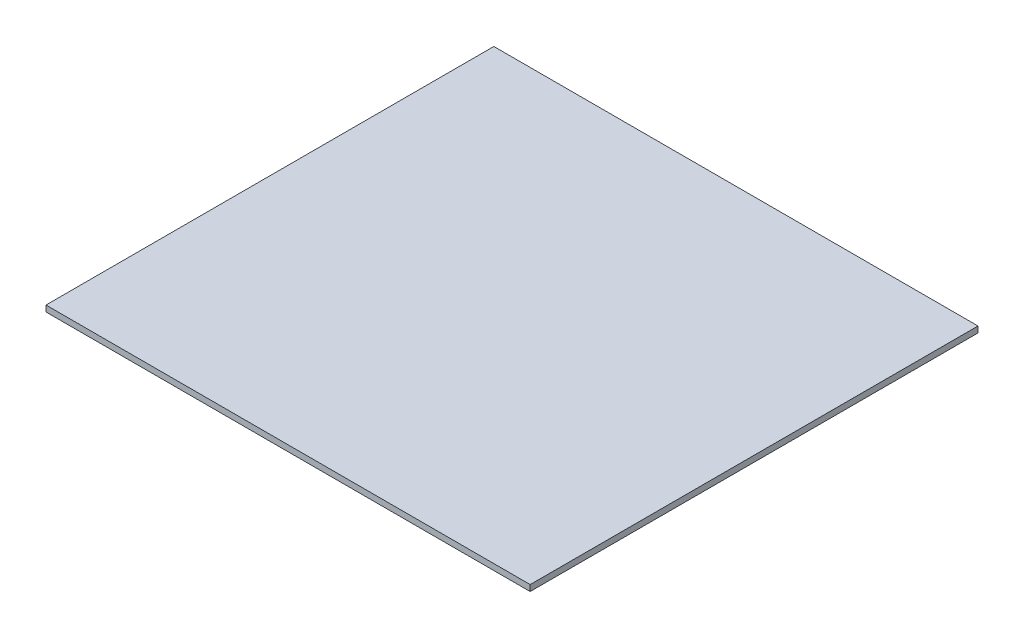
ISO-10303-21;
HEADER;
FILE_DESCRIPTION(('STEP AP214'),'2;1');
FILE_NAME('part.step','',(''),(''),'','','');
FILE_SCHEMA(('AUTOMOTIVE_DESIGN { 1 0 10303 214 1 1 1 1 }'));
ENDSEC;
DATA;
#1=APPLICATION_CONTEXT('core data for automotive mechanical design processes');
#2=APPLICATION_PROTOCOL_DEFINITION('international standard','automotive_design',2000,#1);
#3=PRODUCT_CONTEXT('',#1,'mechanical');
#4=PRODUCT('Part','Part','',(#3));
#5=PRODUCT_RELATED_PRODUCT_CATEGORY('part','',(#4));
#6=PRODUCT_DEFINITION_FORMATION('','',#4);
#7=PRODUCT_DEFINITION_CONTEXT('part definition',#1,'design');
#8=PRODUCT_DEFINITION('design','',#6,#7);
#9=PRODUCT_DEFINITION_SHAPE('','',#8);
#10=(LENGTH_UNIT() NAMED_UNIT(*) SI_UNIT(.MILLI.,.METRE.));
#11=(NAMED_UNIT(*) PLANE_ANGLE_UNIT() SI_UNIT($,.RADIAN.));
#12=(NAMED_UNIT(*) SI_UNIT($,.STERADIAN.) SOLID_ANGLE_UNIT());
#13=UNCERTAINTY_MEASURE_WITH_UNIT(LENGTH_MEASURE(1.E-05),#10,'distance_accuracy_value','');
#14=(GEOMETRIC_REPRESENTATION_CONTEXT(3) GLOBAL_UNCERTAINTY_ASSIGNED_CONTEXT((#13)) GLOBAL_UNIT_ASSIGNED_CONTEXT((#10,
#11,#12)) REPRESENTATION_CONTEXT('',''));
#15=CARTESIAN_POINT('',(0.,0.,0.));
#16=DIRECTION('',(0.,0.,1.));
#17=DIRECTION('',(1.,0.,0.));
#18=AXIS2_PLACEMENT_3D('',#15,#16,#17);
#19=CARTESIAN_POINT('',(0.,6.35,0.));
#20=DIRECTION('',(1.,0.,0.));
#21=DIRECTION('',(0.,0.,-1.));
#22=AXIS2_PLACEMENT_3D('',#19,#20,#21);
#23=PLANE('',#22);
#24=DIRECTION('',(0.,0.,1.));
#25=VECTOR('',#24,1.);
#26=CARTESIAN_POINT('',(0.,0.,0.));
#27=LINE('',#26,#25);
#28=CARTESIAN_POINT('',(0.,0.,-469.9));
#29=VERTEX_POINT('',#28);
#30=CARTESIAN_POINT('',(0.,0.,0.));
#31=VERTEX_POINT('',#30);
#32=EDGE_CURVE('E96',#29,#31,#27,.T.);
#33=ORIENTED_EDGE('',*,*,#32,.T.);
#34=DIRECTION('',(0.,-1.,0.));
#35=VECTOR('',#34,1.);
#36=CARTESIAN_POINT('',(0.,6.35,0.));
#37=LINE('',#36,#35);
#38=CARTESIAN_POINT('',(0.,6.35,0.));
#39=VERTEX_POINT('',#38);
#40=EDGE_CURVE('E11',#39,#31,#37,.T.);
#41=ORIENTED_EDGE('',*,*,#40,.F.);
#42=DIRECTION('',(0.,0.,1.));
#43=VECTOR('',#42,1.);
#44=CARTESIAN_POINT('',(0.,6.35,0.));
#45=LINE('',#44,#43);
#46=CARTESIAN_POINT('',(0.,6.35,-469.9));
#47=VERTEX_POINT('',#46);
#48=EDGE_CURVE('E84',#47,#39,#45,.T.);
#49=ORIENTED_EDGE('',*,*,#48,.F.);
#50=DIRECTION('',(0.,-1.,0.));
#51=VECTOR('',#50,1.);
#52=CARTESIAN_POINT('',(0.,6.35,-469.9));
#53=LINE('',#52,#51);
#54=EDGE_CURVE('E92',#47,#29,#53,.T.);
#55=ORIENTED_EDGE('',*,*,#54,.T.);
#56=EDGE_LOOP('',(#33,#41,#49,#55));
#57=FACE_BOUND('',#56,.T.);
#58=ADVANCED_FACE('F33',(#57),#23,.F.);
#59=CARTESIAN_POINT('',(0.,6.35,0.));
#60=DIRECTION('',(0.,0.,-1.));
#61=DIRECTION('',(-1.,0.,0.));
#62=AXIS2_PLACEMENT_3D('',#59,#60,#61);
#63=PLANE('',#62);
#64=DIRECTION('',(1.,0.,0.));
#65=VECTOR('',#64,1.);
#66=CARTESIAN_POINT('',(0.,0.,0.));
#67=LINE('',#66,#65);
#68=CARTESIAN_POINT('',(508.,0.,0.));
#69=VERTEX_POINT('',#68);
#70=EDGE_CURVE('E88',#31,#69,#67,.T.);
#71=ORIENTED_EDGE('',*,*,#70,.T.);
#72=DIRECTION('',(0.,-1.,0.));
#73=VECTOR('',#72,1.);
#74=CARTESIAN_POINT('',(508.,6.35,0.));
#75=LINE('',#74,#73);
#76=CARTESIAN_POINT('',(508.,6.35,0.));
#77=VERTEX_POINT('',#76);
#78=EDGE_CURVE('E41',#77,#69,#75,.T.);
#79=ORIENTED_EDGE('',*,*,#78,.F.);
#80=DIRECTION('',(1.,0.,0.));
#81=VECTOR('',#80,1.);
#82=CARTESIAN_POINT('',(0.,6.35,0.));
#83=LINE('',#82,#81);
#84=EDGE_CURVE('E79',#39,#77,#83,.T.);
#85=ORIENTED_EDGE('',*,*,#84,.F.);
#86=ORIENTED_EDGE('',*,*,#40,.T.);
#87=EDGE_LOOP('',(#71,#79,#85,#86));
#88=FACE_BOUND('',#87,.T.);
#89=ADVANCED_FACE('F87',(#88),#63,.F.);
#90=CARTESIAN_POINT('',(508.,6.35,0.));
#91=DIRECTION('',(-1.,0.,0.));
#92=DIRECTION('',(0.,0.,1.));
#93=AXIS2_PLACEMENT_3D('',#90,#91,#92);
#94=PLANE('',#93);
#95=DIRECTION('',(0.,0.,-1.));
#96=VECTOR('',#95,1.);
#97=CARTESIAN_POINT('',(508.,0.,0.));
#98=LINE('',#97,#96);
#99=CARTESIAN_POINT('',(508.,0.,-469.9));
#100=VERTEX_POINT('',#99);
#101=EDGE_CURVE('E66',#69,#100,#98,.T.);
#102=ORIENTED_EDGE('',*,*,#101,.T.);
#103=DIRECTION('',(0.,-1.,0.));
#104=VECTOR('',#103,1.);
#105=CARTESIAN_POINT('',(508.,6.35,-469.9));
#106=LINE('',#105,#104);
#107=CARTESIAN_POINT('',(508.,6.35,-469.9));
#108=VERTEX_POINT('',#107);
#109=EDGE_CURVE('E89',#108,#100,#106,.T.);
#110=ORIENTED_EDGE('',*,*,#109,.F.);
#111=DIRECTION('',(0.,0.,-1.));
#112=VECTOR('',#111,1.);
#113=CARTESIAN_POINT('',(508.,6.35,0.));
#114=LINE('',#113,#112);
#115=EDGE_CURVE('E82',#77,#108,#114,.T.);
#116=ORIENTED_EDGE('',*,*,#115,.F.);
#117=ORIENTED_EDGE('',*,*,#78,.T.);
#118=EDGE_LOOP('',(#102,#110,#116,#117));
#119=FACE_BOUND('',#118,.T.);
#120=ADVANCED_FACE('F90',(#119),#94,.F.);
#121=CARTESIAN_POINT('',(0.,6.35,-469.9));
#122=DIRECTION('',(0.,0.,1.));
#123=DIRECTION('',(1.,0.,0.));
#124=AXIS2_PLACEMENT_3D('',#121,#122,#123);
#125=PLANE('',#124);
#126=DIRECTION('',(-1.,0.,0.));
#127=VECTOR('',#126,1.);
#128=CARTESIAN_POINT('',(0.,0.,-469.9));
#129=LINE('',#128,#127);
#130=EDGE_CURVE('E72',#100,#29,#129,.T.);
#131=ORIENTED_EDGE('',*,*,#130,.T.);
#132=ORIENTED_EDGE('',*,*,#54,.F.);
#133=DIRECTION('',(-1.,0.,0.));
#134=VECTOR('',#133,1.);
#135=CARTESIAN_POINT('',(0.,6.35,-469.9));
#136=LINE('',#135,#134);
#137=EDGE_CURVE('E49',#108,#47,#136,.T.);
#138=ORIENTED_EDGE('',*,*,#137,.F.);
#139=ORIENTED_EDGE('',*,*,#109,.T.);
#140=EDGE_LOOP('',(#131,#132,#138,#139));
#141=FACE_BOUND('',#140,.T.);
#142=ADVANCED_FACE('F103',(#141),#125,.F.);
#143=CARTESIAN_POINT('',(0.,6.35,0.));
#144=DIRECTION('',(0.,-1.,0.));
#145=DIRECTION('',(0.,0.,-1.));
#146=AXIS2_PLACEMENT_3D('',#143,#144,#145);
#147=PLANE('',#146);
#148=ORIENTED_EDGE('',*,*,#48,.T.);
#149=ORIENTED_EDGE('',*,*,#84,.T.);
#150=ORIENTED_EDGE('',*,*,#115,.T.);
#151=ORIENTED_EDGE('',*,*,#137,.T.);
#152=EDGE_LOOP('',(#148,#149,#150,#151));
#153=FACE_BOUND('',#152,.T.);
#154=ADVANCED_FACE('F80',(#153),#147,.F.);
#155=CARTESIAN_POINT('',(0.,0.,0.));
#156=DIRECTION('',(0.,-1.,0.));
#157=DIRECTION('',(0.,0.,-1.));
#158=AXIS2_PLACEMENT_3D('',#155,#156,#157);
#159=PLANE('',#158);
#160=ORIENTED_EDGE('',*,*,#32,.F.);
#161=ORIENTED_EDGE('',*,*,#130,.F.);
#162=ORIENTED_EDGE('',*,*,#101,.F.);
#163=ORIENTED_EDGE('',*,*,#70,.F.);
#164=EDGE_LOOP('',(#160,#161,#162,#163));
#165=FACE_BOUND('',#164,.T.);
#166=ADVANCED_FACE('F106',(#165),#159,.T.);
#167=CLOSED_SHELL('',(#58,#89,#120,#142,#154,#166));
#168=MANIFOLD_SOLID_BREP('B2',#167);
#169=ADVANCED_BREP_SHAPE_REPRESENTATION('',(#18,#168),#14);
#170=SHAPE_DEFINITION_REPRESENTATION(#9,#169);
ENDSEC;
END-ISO-10303-21;
